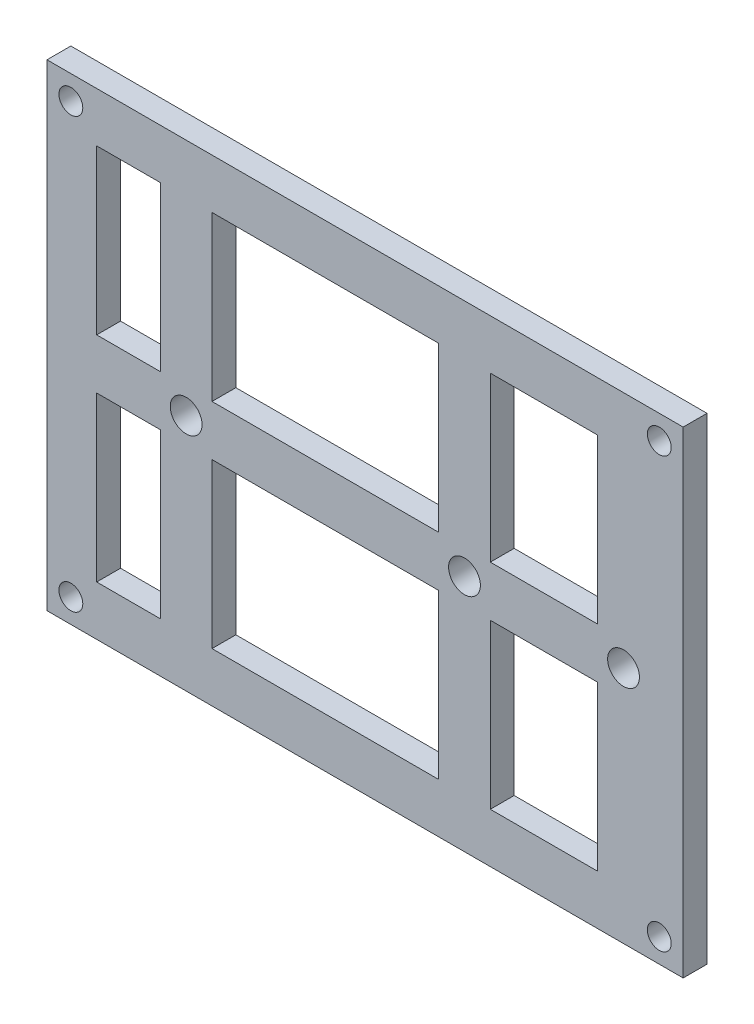
ISO-10303-21;
HEADER;
FILE_DESCRIPTION(('STEP AP214'),'2;1');
FILE_NAME('part.step','',(''),(''),'','','');
FILE_SCHEMA(('AUTOMOTIVE_DESIGN { 1 0 10303 214 1 1 1 1 }'));
ENDSEC;
DATA;
#1=APPLICATION_CONTEXT('core data for automotive mechanical design processes');
#2=APPLICATION_PROTOCOL_DEFINITION('international standard','automotive_design',2000,#1);
#3=PRODUCT_CONTEXT('',#1,'mechanical');
#4=PRODUCT('Part','Part','',(#3));
#5=PRODUCT_RELATED_PRODUCT_CATEGORY('part','',(#4));
#6=PRODUCT_DEFINITION_FORMATION('','',#4);
#7=PRODUCT_DEFINITION_CONTEXT('part definition',#1,'design');
#8=PRODUCT_DEFINITION('design','',#6,#7);
#9=PRODUCT_DEFINITION_SHAPE('','',#8);
#10=(LENGTH_UNIT() NAMED_UNIT(*) SI_UNIT(.MILLI.,.METRE.));
#11=(NAMED_UNIT(*) PLANE_ANGLE_UNIT() SI_UNIT($,.RADIAN.));
#12=(NAMED_UNIT(*) SI_UNIT($,.STERADIAN.) SOLID_ANGLE_UNIT());
#13=UNCERTAINTY_MEASURE_WITH_UNIT(LENGTH_MEASURE(1.E-05),#10,'distance_accuracy_value','');
#14=(GEOMETRIC_REPRESENTATION_CONTEXT(3) GLOBAL_UNCERTAINTY_ASSIGNED_CONTEXT((#13)) GLOBAL_UNIT_ASSIGNED_CONTEXT((#10,
#11,#12)) REPRESENTATION_CONTEXT('',''));
#15=CARTESIAN_POINT('',(0.,0.,0.));
#16=DIRECTION('',(0.,0.,1.));
#17=DIRECTION('',(1.,0.,0.));
#18=AXIS2_PLACEMENT_3D('',#15,#16,#17);
#19=CARTESIAN_POINT('',(0.,0.,3.));
#20=DIRECTION('',(0.,0.,1.));
#21=DIRECTION('',(1.,0.,0.));
#22=AXIS2_PLACEMENT_3D('',#19,#20,#21);
#23=PLANE('',#22);
#24=CARTESIAN_POINT('',(37.,-27.,3.));
#25=DIRECTION('',(0.,0.,1.));
#26=DIRECTION('',(1.,0.,0.));
#27=AXIS2_PLACEMENT_3D('',#24,#25,#26);
#28=CIRCLE('',#27,1.5);
#29=CARTESIAN_POINT('',(38.5,-27.,3.));
#30=VERTEX_POINT('',#29);
#31=EDGE_CURVE('E636',#30,#30,#28,.T.);
#32=ORIENTED_EDGE('',*,*,#31,.F.);
#33=EDGE_LOOP('',(#32));
#34=FACE_BOUND('',#33,.T.);
#35=CARTESIAN_POINT('',(-37.,27.,3.));
#36=DIRECTION('',(0.,0.,1.));
#37=DIRECTION('',(1.,0.,0.));
#38=AXIS2_PLACEMENT_3D('',#35,#36,#37);
#39=CIRCLE('',#38,1.5);
#40=CARTESIAN_POINT('',(-35.5,27.,3.));
#41=VERTEX_POINT('',#40);
#42=EDGE_CURVE('E260',#41,#41,#39,.T.);
#43=ORIENTED_EDGE('',*,*,#42,.F.);
#44=EDGE_LOOP('',(#43));
#45=FACE_BOUND('',#44,.T.);
#46=DIRECTION('',(1.,0.,0.));
#47=VECTOR('',#46,1.);
#48=CARTESIAN_POINT('',(15.75,3.16454204456221,3.));
#49=LINE('',#48,#47);
#50=CARTESIAN_POINT('',(15.75,3.16454204456221,3.));
#51=VERTEX_POINT('',#50);
#52=CARTESIAN_POINT('',(29.25,3.16454204456221,3.));
#53=VERTEX_POINT('',#52);
#54=EDGE_CURVE('E416',#51,#53,#49,.T.);
#55=ORIENTED_EDGE('',*,*,#54,.F.);
#56=DIRECTION('',(0.,-1.,0.));
#57=VECTOR('',#56,1.);
#58=CARTESIAN_POINT('',(15.75,23.75,3.));
#59=LINE('',#58,#57);
#60=CARTESIAN_POINT('',(15.75,23.75,3.));
#61=VERTEX_POINT('',#60);
#62=EDGE_CURVE('E413',#61,#51,#59,.T.);
#63=ORIENTED_EDGE('',*,*,#62,.F.);
#64=DIRECTION('',(-1.,0.,0.));
#65=VECTOR('',#64,1.);
#66=CARTESIAN_POINT('',(15.75,23.75,3.));
#67=LINE('',#66,#65);
#68=CARTESIAN_POINT('',(29.25,23.75,3.));
#69=VERTEX_POINT('',#68);
#70=EDGE_CURVE('E424',#69,#61,#67,.T.);
#71=ORIENTED_EDGE('',*,*,#70,.F.);
#72=DIRECTION('',(0.,1.,0.));
#73=VECTOR('',#72,1.);
#74=CARTESIAN_POINT('',(29.25,23.75,3.));
#75=LINE('',#74,#73);
#76=EDGE_CURVE('E420',#53,#69,#75,.T.);
#77=ORIENTED_EDGE('',*,*,#76,.F.);
#78=EDGE_LOOP('',(#55,#63,#71,#77));
#79=FACE_BOUND('',#78,.T.);
#80=DIRECTION('',(1.,0.,0.));
#81=VECTOR('',#80,1.);
#82=CARTESIAN_POINT('',(-19.25,3.16454204456221,3.));
#83=LINE('',#82,#81);
#84=CARTESIAN_POINT('',(-19.25,3.16454204456221,3.));
#85=VERTEX_POINT('',#84);
#86=CARTESIAN_POINT('',(9.25,3.16454204456221,3.));
#87=VERTEX_POINT('',#86);
#88=EDGE_CURVE('E459',#85,#87,#83,.T.);
#89=ORIENTED_EDGE('',*,*,#88,.F.);
#90=DIRECTION('',(0.,-1.,0.));
#91=VECTOR('',#90,1.);
#92=CARTESIAN_POINT('',(-19.25,23.75,3.));
#93=LINE('',#92,#91);
#94=CARTESIAN_POINT('',(-19.25,23.75,3.));
#95=VERTEX_POINT('',#94);
#96=EDGE_CURVE('E456',#95,#85,#93,.T.);
#97=ORIENTED_EDGE('',*,*,#96,.F.);
#98=DIRECTION('',(-1.,0.,0.));
#99=VECTOR('',#98,1.);
#100=CARTESIAN_POINT('',(-19.25,23.75,3.));
#101=LINE('',#100,#99);
#102=CARTESIAN_POINT('',(9.25,23.75,3.));
#103=VERTEX_POINT('',#102);
#104=EDGE_CURVE('E467',#103,#95,#101,.T.);
#105=ORIENTED_EDGE('',*,*,#104,.F.);
#106=DIRECTION('',(0.,1.,0.));
#107=VECTOR('',#106,1.);
#108=CARTESIAN_POINT('',(9.25,23.75,3.));
#109=LINE('',#108,#107);
#110=EDGE_CURVE('E463',#87,#103,#109,.T.);
#111=ORIENTED_EDGE('',*,*,#110,.F.);
#112=EDGE_LOOP('',(#89,#97,#105,#111));
#113=FACE_BOUND('',#112,.T.);
#114=CARTESIAN_POINT('',(12.5,0.,3.));
#115=DIRECTION('',(0.,0.,1.));
#116=DIRECTION('',(1.,0.,0.));
#117=AXIS2_PLACEMENT_3D('',#114,#115,#116);
#118=CIRCLE('',#117,2.);
#119=CARTESIAN_POINT('',(14.5,0.,3.));
#120=VERTEX_POINT('',#119);
#121=EDGE_CURVE('E499',#120,#120,#118,.T.);
#122=ORIENTED_EDGE('',*,*,#121,.F.);
#123=EDGE_LOOP('',(#122));
#124=FACE_BOUND('',#123,.T.);
#125=DIRECTION('',(0.,1.,0.));
#126=VECTOR('',#125,1.);
#127=CARTESIAN_POINT('',(40.,30.,3.));
#128=LINE('',#127,#126);
#129=CARTESIAN_POINT('',(40.,-30.,3.));
#130=VERTEX_POINT('',#129);
#131=CARTESIAN_POINT('',(40.,30.,3.));
#132=VERTEX_POINT('',#131);
#133=EDGE_CURVE('E515',#130,#132,#128,.T.);
#134=ORIENTED_EDGE('',*,*,#133,.T.);
#135=DIRECTION('',(-1.,0.,0.));
#136=VECTOR('',#135,1.);
#137=CARTESIAN_POINT('',(-40.,30.,3.));
#138=LINE('',#137,#136);
#139=CARTESIAN_POINT('',(-40.,30.,3.));
#140=VERTEX_POINT('',#139);
#141=EDGE_CURVE('E519',#132,#140,#138,.T.);
#142=ORIENTED_EDGE('',*,*,#141,.T.);
#143=DIRECTION('',(0.,-1.,0.));
#144=VECTOR('',#143,1.);
#145=CARTESIAN_POINT('',(-40.,30.,3.));
#146=LINE('',#145,#144);
#147=CARTESIAN_POINT('',(-40.,-30.,3.));
#148=VERTEX_POINT('',#147);
#149=EDGE_CURVE('E523',#140,#148,#146,.T.);
#150=ORIENTED_EDGE('',*,*,#149,.T.);
#151=DIRECTION('',(1.,0.,0.));
#152=VECTOR('',#151,1.);
#153=CARTESIAN_POINT('',(-40.,-30.,3.));
#154=LINE('',#153,#152);
#155=EDGE_CURVE('E526',#148,#130,#154,.T.);
#156=ORIENTED_EDGE('',*,*,#155,.T.);
#157=EDGE_LOOP('',(#134,#142,#150,#156));
#158=FACE_BOUND('',#157,.T.);
#159=CARTESIAN_POINT('',(32.5,0.,3.));
#160=DIRECTION('',(0.,0.,1.));
#161=DIRECTION('',(1.,0.,0.));
#162=AXIS2_PLACEMENT_3D('',#159,#160,#161);
#163=CIRCLE('',#162,2.);
#164=CARTESIAN_POINT('',(34.5,0.,3.));
#165=VERTEX_POINT('',#164);
#166=EDGE_CURVE('E507',#165,#165,#163,.T.);
#167=ORIENTED_EDGE('',*,*,#166,.F.);
#168=EDGE_LOOP('',(#167));
#169=FACE_BOUND('',#168,.T.);
#170=CARTESIAN_POINT('',(-22.5,0.,3.));
#171=DIRECTION('',(0.,0.,1.));
#172=DIRECTION('',(1.,0.,0.));
#173=AXIS2_PLACEMENT_3D('',#170,#171,#172);
#174=CIRCLE('',#173,2.);
#175=CARTESIAN_POINT('',(-20.5,0.,3.));
#176=VERTEX_POINT('',#175);
#177=EDGE_CURVE('E405',#176,#176,#174,.T.);
#178=ORIENTED_EDGE('',*,*,#177,.F.);
#179=EDGE_LOOP('',(#178));
#180=FACE_BOUND('',#179,.T.);
#181=DIRECTION('',(1.,0.,0.));
#182=VECTOR('',#181,1.);
#183=CARTESIAN_POINT('',(-33.75,3.16454204456221,3.));
#184=LINE('',#183,#182);
#185=CARTESIAN_POINT('',(-33.75,3.16454204456221,3.));
#186=VERTEX_POINT('',#185);
#187=CARTESIAN_POINT('',(-25.75,3.16454204456221,3.));
#188=VERTEX_POINT('',#187);
#189=EDGE_CURVE('E365',#186,#188,#184,.T.);
#190=ORIENTED_EDGE('',*,*,#189,.F.);
#191=DIRECTION('',(0.,-1.,0.));
#192=VECTOR('',#191,1.);
#193=CARTESIAN_POINT('',(-33.75,23.75,3.));
#194=LINE('',#193,#192);
#195=CARTESIAN_POINT('',(-33.75,23.75,3.));
#196=VERTEX_POINT('',#195);
#197=EDGE_CURVE('E362',#196,#186,#194,.T.);
#198=ORIENTED_EDGE('',*,*,#197,.F.);
#199=DIRECTION('',(-1.,0.,0.));
#200=VECTOR('',#199,1.);
#201=CARTESIAN_POINT('',(-33.75,23.75,3.));
#202=LINE('',#201,#200);
#203=CARTESIAN_POINT('',(-25.75,23.75,3.));
#204=VERTEX_POINT('',#203);
#205=EDGE_CURVE('E373',#204,#196,#202,.T.);
#206=ORIENTED_EDGE('',*,*,#205,.F.);
#207=DIRECTION('',(0.,1.,0.));
#208=VECTOR('',#207,1.);
#209=CARTESIAN_POINT('',(-25.75,23.75,3.));
#210=LINE('',#209,#208);
#211=EDGE_CURVE('E369',#188,#204,#210,.T.);
#212=ORIENTED_EDGE('',*,*,#211,.F.);
#213=EDGE_LOOP('',(#190,#198,#206,#212));
#214=FACE_BOUND('',#213,.T.);
#215=DIRECTION('',(1.,0.,0.));
#216=VECTOR('',#215,1.);
#217=CARTESIAN_POINT('',(15.75,-23.75,3.));
#218=LINE('',#217,#216);
#219=CARTESIAN_POINT('',(15.75,-23.75,3.));
#220=VERTEX_POINT('',#219);
#221=CARTESIAN_POINT('',(29.25,-23.75,3.));
#222=VERTEX_POINT('',#221);
#223=EDGE_CURVE('E322',#220,#222,#218,.T.);
#224=ORIENTED_EDGE('',*,*,#223,.F.);
#225=DIRECTION('',(0.,-1.,0.));
#226=VECTOR('',#225,1.);
#227=CARTESIAN_POINT('',(15.75,-23.75,3.));
#228=LINE('',#227,#226);
#229=CARTESIAN_POINT('',(15.75,-3.16454204456221,3.));
#230=VERTEX_POINT('',#229);
#231=EDGE_CURVE('E319',#230,#220,#228,.T.);
#232=ORIENTED_EDGE('',*,*,#231,.F.);
#233=DIRECTION('',(-1.,0.,0.));
#234=VECTOR('',#233,1.);
#235=CARTESIAN_POINT('',(15.75,-3.16454204456221,3.));
#236=LINE('',#235,#234);
#237=CARTESIAN_POINT('',(29.25,-3.16454204456221,3.));
#238=VERTEX_POINT('',#237);
#239=EDGE_CURVE('E330',#238,#230,#236,.T.);
#240=ORIENTED_EDGE('',*,*,#239,.F.);
#241=DIRECTION('',(0.,1.,0.));
#242=VECTOR('',#241,1.);
#243=CARTESIAN_POINT('',(29.25,-23.75,3.));
#244=LINE('',#243,#242);
#245=EDGE_CURVE('E326',#222,#238,#244,.T.);
#246=ORIENTED_EDGE('',*,*,#245,.F.);
#247=EDGE_LOOP('',(#224,#232,#240,#246));
#248=FACE_BOUND('',#247,.T.);
#249=DIRECTION('',(1.,0.,0.));
#250=VECTOR('',#249,1.);
#251=CARTESIAN_POINT('',(-19.25,-23.75,3.));
#252=LINE('',#251,#250);
#253=CARTESIAN_POINT('',(-19.25,-23.75,3.));
#254=VERTEX_POINT('',#253);
#255=CARTESIAN_POINT('',(9.25,-23.75,3.));
#256=VERTEX_POINT('',#255);
#257=EDGE_CURVE('E279',#254,#256,#252,.T.);
#258=ORIENTED_EDGE('',*,*,#257,.F.);
#259=DIRECTION('',(0.,-1.,0.));
#260=VECTOR('',#259,1.);
#261=CARTESIAN_POINT('',(-19.25,-23.75,3.));
#262=LINE('',#261,#260);
#263=CARTESIAN_POINT('',(-19.25,-3.16454204456221,3.));
#264=VERTEX_POINT('',#263);
#265=EDGE_CURVE('E276',#264,#254,#262,.T.);
#266=ORIENTED_EDGE('',*,*,#265,.F.);
#267=DIRECTION('',(-1.,0.,0.));
#268=VECTOR('',#267,1.);
#269=CARTESIAN_POINT('',(-19.25,-3.16454204456221,3.));
#270=LINE('',#269,#268);
#271=CARTESIAN_POINT('',(9.25,-3.16454204456221,3.));
#272=VERTEX_POINT('',#271);
#273=EDGE_CURVE('E287',#272,#264,#270,.T.);
#274=ORIENTED_EDGE('',*,*,#273,.F.);
#275=DIRECTION('',(0.,1.,0.));
#276=VECTOR('',#275,1.);
#277=CARTESIAN_POINT('',(9.25,-23.75,3.));
#278=LINE('',#277,#276);
#279=EDGE_CURVE('E283',#256,#272,#278,.T.);
#280=ORIENTED_EDGE('',*,*,#279,.F.);
#281=EDGE_LOOP('',(#258,#266,#274,#280));
#282=FACE_BOUND('',#281,.T.);
#283=DIRECTION('',(1.,0.,0.));
#284=VECTOR('',#283,1.);
#285=CARTESIAN_POINT('',(-33.75,-23.75,3.));
#286=LINE('',#285,#284);
#287=CARTESIAN_POINT('',(-33.75,-23.75,3.));
#288=VERTEX_POINT('',#287);
#289=CARTESIAN_POINT('',(-25.75,-23.75,3.));
#290=VERTEX_POINT('',#289);
#291=EDGE_CURVE('E234',#288,#290,#286,.T.);
#292=ORIENTED_EDGE('',*,*,#291,.F.);
#293=DIRECTION('',(0.,-1.,0.));
#294=VECTOR('',#293,1.);
#295=CARTESIAN_POINT('',(-33.75,-23.75,3.));
#296=LINE('',#295,#294);
#297=CARTESIAN_POINT('',(-33.75,-3.16454204456221,3.));
#298=VERTEX_POINT('',#297);
#299=EDGE_CURVE('E225',#298,#288,#296,.T.);
#300=ORIENTED_EDGE('',*,*,#299,.F.);
#301=DIRECTION('',(-1.,0.,0.));
#302=VECTOR('',#301,1.);
#303=CARTESIAN_POINT('',(-33.75,-3.16454204456221,3.));
#304=LINE('',#303,#302);
#305=CARTESIAN_POINT('',(-25.75,-3.16454204456221,3.));
#306=VERTEX_POINT('',#305);
#307=EDGE_CURVE('E252',#306,#298,#304,.T.);
#308=ORIENTED_EDGE('',*,*,#307,.F.);
#309=DIRECTION('',(0.,1.,0.));
#310=VECTOR('',#309,1.);
#311=CARTESIAN_POINT('',(-25.75,-23.75,3.));
#312=LINE('',#311,#310);
#313=EDGE_CURVE('E248',#290,#306,#312,.T.);
#314=ORIENTED_EDGE('',*,*,#313,.F.);
#315=EDGE_LOOP('',(#292,#300,#308,#314));
#316=FACE_BOUND('',#315,.T.);
#317=CARTESIAN_POINT('',(-37.,-27.,3.));
#318=DIRECTION('',(0.,0.,1.));
#319=DIRECTION('',(-1.,0.,0.));
#320=AXIS2_PLACEMENT_3D('',#317,#318,#319);
#321=CIRCLE('',#320,1.5);
#322=CARTESIAN_POINT('',(-38.5,-27.,3.));
#323=VERTEX_POINT('',#322);
#324=EDGE_CURVE('E642',#323,#323,#321,.T.);
#325=ORIENTED_EDGE('',*,*,#324,.F.);
#326=EDGE_LOOP('',(#325));
#327=FACE_BOUND('',#326,.T.);
#328=CARTESIAN_POINT('',(37.,27.,3.));
#329=DIRECTION('',(0.,0.,1.));
#330=DIRECTION('',(-1.,0.,0.));
#331=AXIS2_PLACEMENT_3D('',#328,#329,#330);
#332=CIRCLE('',#331,1.5);
#333=CARTESIAN_POINT('',(35.5,27.,3.));
#334=VERTEX_POINT('',#333);
#335=EDGE_CURVE('E630',#334,#334,#332,.T.);
#336=ORIENTED_EDGE('',*,*,#335,.F.);
#337=EDGE_LOOP('',(#336));
#338=FACE_BOUND('',#337,.T.);
#339=ADVANCED_FACE('F39',(#34,#45,#79,#113,#124,#158,#169,#180,#214,#248,#282,#316,#327,#338),
#23,.T.);
#340=CARTESIAN_POINT('',(0.,0.,0.));
#341=DIRECTION('',(0.,0.,1.));
#342=DIRECTION('',(1.,0.,0.));
#343=AXIS2_PLACEMENT_3D('',#340,#341,#342);
#344=PLANE('',#343);
#345=DIRECTION('',(0.,-1.,0.));
#346=VECTOR('',#345,1.);
#347=CARTESIAN_POINT('',(-19.25,-23.75,0.));
#348=LINE('',#347,#346);
#349=CARTESIAN_POINT('',(-19.25,-3.16454204456221,0.));
#350=VERTEX_POINT('',#349);
#351=CARTESIAN_POINT('',(-19.25,-23.75,0.));
#352=VERTEX_POINT('',#351);
#353=EDGE_CURVE('E243',#350,#352,#348,.T.);
#354=ORIENTED_EDGE('',*,*,#353,.T.);
#355=DIRECTION('',(1.,0.,0.));
#356=VECTOR('',#355,1.);
#357=CARTESIAN_POINT('',(-19.25,-23.75,0.));
#358=LINE('',#357,#356);
#359=CARTESIAN_POINT('',(9.25,-23.75,0.));
#360=VERTEX_POINT('',#359);
#361=EDGE_CURVE('E294',#352,#360,#358,.T.);
#362=ORIENTED_EDGE('',*,*,#361,.T.);
#363=DIRECTION('',(0.,1.,0.));
#364=VECTOR('',#363,1.);
#365=CARTESIAN_POINT('',(9.25,-23.75,0.));
#366=LINE('',#365,#364);
#367=CARTESIAN_POINT('',(9.25,-3.16454204456221,0.));
#368=VERTEX_POINT('',#367);
#369=EDGE_CURVE('E298',#360,#368,#366,.T.);
#370=ORIENTED_EDGE('',*,*,#369,.T.);
#371=DIRECTION('',(-1.,0.,0.));
#372=VECTOR('',#371,1.);
#373=CARTESIAN_POINT('',(-19.25,-3.16454204456221,0.));
#374=LINE('',#373,#372);
#375=EDGE_CURVE('E280',#368,#350,#374,.T.);
#376=ORIENTED_EDGE('',*,*,#375,.T.);
#377=EDGE_LOOP('',(#354,#362,#370,#376));
#378=FACE_BOUND('',#377,.T.);
#379=DIRECTION('',(0.,-1.,0.));
#380=VECTOR('',#379,1.);
#381=CARTESIAN_POINT('',(-33.75,23.75,0.));
#382=LINE('',#381,#380);
#383=CARTESIAN_POINT('',(-33.75,23.75,0.));
#384=VERTEX_POINT('',#383);
#385=CARTESIAN_POINT('',(-33.75,3.16454204456221,0.));
#386=VERTEX_POINT('',#385);
#387=EDGE_CURVE('E361',#384,#386,#382,.T.);
#388=ORIENTED_EDGE('',*,*,#387,.T.);
#389=DIRECTION('',(1.,0.,0.));
#390=VECTOR('',#389,1.);
#391=CARTESIAN_POINT('',(-33.75,3.16454204456221,0.));
#392=LINE('',#391,#390);
#393=CARTESIAN_POINT('',(-25.75,3.16454204456221,0.));
#394=VERTEX_POINT('',#393);
#395=EDGE_CURVE('E380',#386,#394,#392,.T.);
#396=ORIENTED_EDGE('',*,*,#395,.T.);
#397=DIRECTION('',(0.,1.,0.));
#398=VECTOR('',#397,1.);
#399=CARTESIAN_POINT('',(-25.75,23.75,0.));
#400=LINE('',#399,#398);
#401=CARTESIAN_POINT('',(-25.75,23.75,0.));
#402=VERTEX_POINT('',#401);
#403=EDGE_CURVE('E384',#394,#402,#400,.T.);
#404=ORIENTED_EDGE('',*,*,#403,.T.);
#405=DIRECTION('',(-1.,0.,0.));
#406=VECTOR('',#405,1.);
#407=CARTESIAN_POINT('',(-33.75,23.75,0.));
#408=LINE('',#407,#406);
#409=EDGE_CURVE('E366',#402,#384,#408,.T.);
#410=ORIENTED_EDGE('',*,*,#409,.T.);
#411=EDGE_LOOP('',(#388,#396,#404,#410));
#412=FACE_BOUND('',#411,.T.);
#413=DIRECTION('',(0.,-1.,0.));
#414=VECTOR('',#413,1.);
#415=CARTESIAN_POINT('',(-19.25,23.75,0.));
#416=LINE('',#415,#414);
#417=CARTESIAN_POINT('',(-19.25,23.75,0.));
#418=VERTEX_POINT('',#417);
#419=CARTESIAN_POINT('',(-19.25,3.16454204456221,0.));
#420=VERTEX_POINT('',#419);
#421=EDGE_CURVE('E455',#418,#420,#416,.T.);
#422=ORIENTED_EDGE('',*,*,#421,.T.);
#423=DIRECTION('',(1.,0.,0.));
#424=VECTOR('',#423,1.);
#425=CARTESIAN_POINT('',(-19.25,3.16454204456221,0.));
#426=LINE('',#425,#424);
#427=CARTESIAN_POINT('',(9.25,3.16454204456221,0.));
#428=VERTEX_POINT('',#427);
#429=EDGE_CURVE('E474',#420,#428,#426,.T.);
#430=ORIENTED_EDGE('',*,*,#429,.T.);
#431=DIRECTION('',(0.,1.,0.));
#432=VECTOR('',#431,1.);
#433=CARTESIAN_POINT('',(9.25,23.75,0.));
#434=LINE('',#433,#432);
#435=CARTESIAN_POINT('',(9.25,23.75,0.));
#436=VERTEX_POINT('',#435);
#437=EDGE_CURVE('E478',#428,#436,#434,.T.);
#438=ORIENTED_EDGE('',*,*,#437,.T.);
#439=DIRECTION('',(-1.,0.,0.));
#440=VECTOR('',#439,1.);
#441=CARTESIAN_POINT('',(-19.25,23.75,0.));
#442=LINE('',#441,#440);
#443=EDGE_CURVE('E460',#436,#418,#442,.T.);
#444=ORIENTED_EDGE('',*,*,#443,.T.);
#445=EDGE_LOOP('',(#422,#430,#438,#444));
#446=FACE_BOUND('',#445,.T.);
#447=DIRECTION('',(0.,1.,0.));
#448=VECTOR('',#447,1.);
#449=CARTESIAN_POINT('',(40.,30.,0.));
#450=LINE('',#449,#448);
#451=CARTESIAN_POINT('',(40.,-30.,0.));
#452=VERTEX_POINT('',#451);
#453=CARTESIAN_POINT('',(40.,30.,0.));
#454=VERTEX_POINT('',#453);
#455=EDGE_CURVE('E511',#452,#454,#450,.T.);
#456=ORIENTED_EDGE('',*,*,#455,.F.);
#457=DIRECTION('',(1.,0.,0.));
#458=VECTOR('',#457,1.);
#459=CARTESIAN_POINT('',(-40.,-30.,0.));
#460=LINE('',#459,#458);
#461=CARTESIAN_POINT('',(-40.,-30.,0.));
#462=VERTEX_POINT('',#461);
#463=EDGE_CURVE('E520',#462,#452,#460,.T.);
#464=ORIENTED_EDGE('',*,*,#463,.F.);
#465=DIRECTION('',(0.,-1.,0.));
#466=VECTOR('',#465,1.);
#467=CARTESIAN_POINT('',(-40.,30.,0.));
#468=LINE('',#467,#466);
#469=CARTESIAN_POINT('',(-40.,30.,0.));
#470=VERTEX_POINT('',#469);
#471=EDGE_CURVE('E536',#470,#462,#468,.T.);
#472=ORIENTED_EDGE('',*,*,#471,.F.);
#473=DIRECTION('',(-1.,0.,0.));
#474=VECTOR('',#473,1.);
#475=CARTESIAN_POINT('',(-40.,30.,0.));
#476=LINE('',#475,#474);
#477=EDGE_CURVE('E533',#454,#470,#476,.T.);
#478=ORIENTED_EDGE('',*,*,#477,.F.);
#479=EDGE_LOOP('',(#456,#464,#472,#478));
#480=FACE_BOUND('',#479,.T.);
#481=CARTESIAN_POINT('',(32.5,0.,0.));
#482=DIRECTION('',(0.,0.,1.));
#483=DIRECTION('',(1.,0.,0.));
#484=AXIS2_PLACEMENT_3D('',#481,#482,#483);
#485=CIRCLE('',#484,2.);
#486=CARTESIAN_POINT('',(34.5,0.,0.));
#487=VERTEX_POINT('',#486);
#488=EDGE_CURVE('E503',#487,#487,#485,.T.);
#489=ORIENTED_EDGE('',*,*,#488,.T.);
#490=EDGE_LOOP('',(#489));
#491=FACE_BOUND('',#490,.T.);
#492=CARTESIAN_POINT('',(12.5,0.,0.));
#493=DIRECTION('',(0.,0.,1.));
#494=DIRECTION('',(1.,0.,0.));
#495=AXIS2_PLACEMENT_3D('',#492,#493,#494);
#496=CIRCLE('',#495,2.);
#497=CARTESIAN_POINT('',(14.5,0.,0.));
#498=VERTEX_POINT('',#497);
#499=EDGE_CURVE('E498',#498,#498,#496,.T.);
#500=ORIENTED_EDGE('',*,*,#499,.T.);
#501=EDGE_LOOP('',(#500));
#502=FACE_BOUND('',#501,.T.);
#503=DIRECTION('',(0.,-1.,0.));
#504=VECTOR('',#503,1.);
#505=CARTESIAN_POINT('',(15.75,23.75,0.));
#506=LINE('',#505,#504);
#507=CARTESIAN_POINT('',(15.75,23.75,0.));
#508=VERTEX_POINT('',#507);
#509=CARTESIAN_POINT('',(15.75,3.16454204456221,0.));
#510=VERTEX_POINT('',#509);
#511=EDGE_CURVE('E409',#508,#510,#506,.T.);
#512=ORIENTED_EDGE('',*,*,#511,.T.);
#513=DIRECTION('',(1.,0.,0.));
#514=VECTOR('',#513,1.);
#515=CARTESIAN_POINT('',(15.75,3.16454204456221,0.));
#516=LINE('',#515,#514);
#517=CARTESIAN_POINT('',(29.25,3.16454204456221,0.));
#518=VERTEX_POINT('',#517);
#519=EDGE_CURVE('E431',#510,#518,#516,.T.);
#520=ORIENTED_EDGE('',*,*,#519,.T.);
#521=DIRECTION('',(0.,1.,0.));
#522=VECTOR('',#521,1.);
#523=CARTESIAN_POINT('',(29.25,23.75,0.));
#524=LINE('',#523,#522);
#525=CARTESIAN_POINT('',(29.25,23.75,0.));
#526=VERTEX_POINT('',#525);
#527=EDGE_CURVE('E435',#518,#526,#524,.T.);
#528=ORIENTED_EDGE('',*,*,#527,.T.);
#529=DIRECTION('',(-1.,0.,0.));
#530=VECTOR('',#529,1.);
#531=CARTESIAN_POINT('',(15.75,23.75,0.));
#532=LINE('',#531,#530);
#533=EDGE_CURVE('E417',#526,#508,#532,.T.);
#534=ORIENTED_EDGE('',*,*,#533,.T.);
#535=EDGE_LOOP('',(#512,#520,#528,#534));
#536=FACE_BOUND('',#535,.T.);
#537=CARTESIAN_POINT('',(-22.5,0.,0.));
#538=DIRECTION('',(0.,0.,1.));
#539=DIRECTION('',(1.,0.,0.));
#540=AXIS2_PLACEMENT_3D('',#537,#538,#539);
#541=CIRCLE('',#540,2.);
#542=CARTESIAN_POINT('',(-20.5,0.,0.));
#543=VERTEX_POINT('',#542);
#544=EDGE_CURVE('E404',#543,#543,#541,.T.);
#545=ORIENTED_EDGE('',*,*,#544,.T.);
#546=EDGE_LOOP('',(#545));
#547=FACE_BOUND('',#546,.T.);
#548=DIRECTION('',(0.,-1.,0.));
#549=VECTOR('',#548,1.);
#550=CARTESIAN_POINT('',(15.75,-23.75,0.));
#551=LINE('',#550,#549);
#552=CARTESIAN_POINT('',(15.75,-3.16454204456221,0.));
#553=VERTEX_POINT('',#552);
#554=CARTESIAN_POINT('',(15.75,-23.75,0.));
#555=VERTEX_POINT('',#554);
#556=EDGE_CURVE('E318',#553,#555,#551,.T.);
#557=ORIENTED_EDGE('',*,*,#556,.T.);
#558=DIRECTION('',(1.,0.,0.));
#559=VECTOR('',#558,1.);
#560=CARTESIAN_POINT('',(15.75,-23.75,0.));
#561=LINE('',#560,#559);
#562=CARTESIAN_POINT('',(29.25,-23.75,0.));
#563=VERTEX_POINT('',#562);
#564=EDGE_CURVE('E337',#555,#563,#561,.T.);
#565=ORIENTED_EDGE('',*,*,#564,.T.);
#566=DIRECTION('',(0.,1.,0.));
#567=VECTOR('',#566,1.);
#568=CARTESIAN_POINT('',(29.25,-23.75,0.));
#569=LINE('',#568,#567);
#570=CARTESIAN_POINT('',(29.25,-3.16454204456221,0.));
#571=VERTEX_POINT('',#570);
#572=EDGE_CURVE('E341',#563,#571,#569,.T.);
#573=ORIENTED_EDGE('',*,*,#572,.T.);
#574=DIRECTION('',(-1.,0.,0.));
#575=VECTOR('',#574,1.);
#576=CARTESIAN_POINT('',(15.75,-3.16454204456221,0.));
#577=LINE('',#576,#575);
#578=EDGE_CURVE('E323',#571,#553,#577,.T.);
#579=ORIENTED_EDGE('',*,*,#578,.T.);
#580=EDGE_LOOP('',(#557,#565,#573,#579));
#581=FACE_BOUND('',#580,.T.);
#582=DIRECTION('',(0.,-1.,0.));
#583=VECTOR('',#582,1.);
#584=CARTESIAN_POINT('',(-33.75,-23.75,0.));
#585=LINE('',#584,#583);
#586=CARTESIAN_POINT('',(-33.75,-3.16454204456221,0.));
#587=VERTEX_POINT('',#586);
#588=CARTESIAN_POINT('',(-33.75,-23.75,0.));
#589=VERTEX_POINT('',#588);
#590=EDGE_CURVE('E63',#587,#589,#585,.T.);
#591=ORIENTED_EDGE('',*,*,#590,.T.);
#592=DIRECTION('',(1.,0.,0.));
#593=VECTOR('',#592,1.);
#594=CARTESIAN_POINT('',(-33.75,-23.75,0.));
#595=LINE('',#594,#593);
#596=CARTESIAN_POINT('',(-25.75,-23.75,0.));
#597=VERTEX_POINT('',#596);
#598=EDGE_CURVE('E241',#589,#597,#595,.T.);
#599=ORIENTED_EDGE('',*,*,#598,.T.);
#600=DIRECTION('',(0.,1.,0.));
#601=VECTOR('',#600,1.);
#602=CARTESIAN_POINT('',(-25.75,-23.75,0.));
#603=LINE('',#602,#601);
#604=CARTESIAN_POINT('',(-25.75,-3.16454204456221,0.));
#605=VERTEX_POINT('',#604);
#606=EDGE_CURVE('E263',#597,#605,#603,.T.);
#607=ORIENTED_EDGE('',*,*,#606,.T.);
#608=DIRECTION('',(-1.,0.,0.));
#609=VECTOR('',#608,1.);
#610=CARTESIAN_POINT('',(-33.75,-3.16454204456221,0.));
#611=LINE('',#610,#609);
#612=EDGE_CURVE('E235',#605,#587,#611,.T.);
#613=ORIENTED_EDGE('',*,*,#612,.T.);
#614=EDGE_LOOP('',(#591,#599,#607,#613));
#615=FACE_BOUND('',#614,.T.);
#616=CARTESIAN_POINT('',(-37.,27.,0.));
#617=DIRECTION('',(0.,0.,1.));
#618=DIRECTION('',(1.,0.,0.));
#619=AXIS2_PLACEMENT_3D('',#616,#617,#618);
#620=CIRCLE('',#619,1.5);
#621=CARTESIAN_POINT('',(-35.5,27.,0.));
#622=VERTEX_POINT('',#621);
#623=EDGE_CURVE('E616',#622,#622,#620,.T.);
#624=ORIENTED_EDGE('',*,*,#623,.T.);
#625=EDGE_LOOP('',(#624));
#626=FACE_BOUND('',#625,.T.);
#627=CARTESIAN_POINT('',(-37.,-27.,0.));
#628=DIRECTION('',(0.,0.,1.));
#629=DIRECTION('',(-1.,0.,0.));
#630=AXIS2_PLACEMENT_3D('',#627,#628,#629);
#631=CIRCLE('',#630,1.5);
#632=CARTESIAN_POINT('',(-38.5,-27.,0.));
#633=VERTEX_POINT('',#632);
#634=EDGE_CURVE('E620',#633,#633,#631,.T.);
#635=ORIENTED_EDGE('',*,*,#634,.T.);
#636=EDGE_LOOP('',(#635));
#637=FACE_BOUND('',#636,.T.);
#638=CARTESIAN_POINT('',(37.,-27.,0.));
#639=DIRECTION('',(0.,0.,1.));
#640=DIRECTION('',(1.,0.,0.));
#641=AXIS2_PLACEMENT_3D('',#638,#639,#640);
#642=CIRCLE('',#641,1.5);
#643=CARTESIAN_POINT('',(38.5,-27.,0.));
#644=VERTEX_POINT('',#643);
#645=EDGE_CURVE('E624',#644,#644,#642,.T.);
#646=ORIENTED_EDGE('',*,*,#645,.T.);
#647=EDGE_LOOP('',(#646));
#648=FACE_BOUND('',#647,.T.);
#649=CARTESIAN_POINT('',(37.,27.,0.));
#650=DIRECTION('',(0.,0.,1.));
#651=DIRECTION('',(-1.,0.,0.));
#652=AXIS2_PLACEMENT_3D('',#649,#650,#651);
#653=CIRCLE('',#652,1.5);
#654=CARTESIAN_POINT('',(35.5,27.,0.));
#655=VERTEX_POINT('',#654);
#656=EDGE_CURVE('E627',#655,#655,#653,.T.);
#657=ORIENTED_EDGE('',*,*,#656,.T.);
#658=EDGE_LOOP('',(#657));
#659=FACE_BOUND('',#658,.T.);
#660=ADVANCED_FACE('F559',(#378,#412,#446,#480,#491,#502,#536,#547,#581,#615,#626,#637,#648,
#659),#344,.F.);
#661=CARTESIAN_POINT('',(40.,30.,3.));
#662=DIRECTION('',(-1.,0.,0.));
#663=DIRECTION('',(0.,0.,1.));
#664=AXIS2_PLACEMENT_3D('',#661,#662,#663);
#665=PLANE('',#664);
#666=ORIENTED_EDGE('',*,*,#455,.T.);
#667=DIRECTION('',(0.,0.,-1.));
#668=VECTOR('',#667,1.);
#669=CARTESIAN_POINT('',(40.,30.,3.));
#670=LINE('',#669,#668);
#671=EDGE_CURVE('E11',#132,#454,#670,.T.);
#672=ORIENTED_EDGE('',*,*,#671,.F.);
#673=ORIENTED_EDGE('',*,*,#133,.F.);
#674=DIRECTION('',(0.,0.,-1.));
#675=VECTOR('',#674,1.);
#676=CARTESIAN_POINT('',(40.,-30.,3.));
#677=LINE('',#676,#675);
#678=EDGE_CURVE('E529',#130,#452,#677,.T.);
#679=ORIENTED_EDGE('',*,*,#678,.T.);
#680=EDGE_LOOP('',(#666,#672,#673,#679));
#681=FACE_BOUND('',#680,.T.);
#682=ADVANCED_FACE('F41',(#681),#665,.F.);
#683=CARTESIAN_POINT('',(-40.,30.,3.));
#684=DIRECTION('',(0.,-1.,0.));
#685=DIRECTION('',(0.,0.,-1.));
#686=AXIS2_PLACEMENT_3D('',#683,#684,#685);
#687=PLANE('',#686);
#688=ORIENTED_EDGE('',*,*,#477,.T.);
#689=DIRECTION('',(0.,0.,-1.));
#690=VECTOR('',#689,1.);
#691=CARTESIAN_POINT('',(-40.,30.,3.));
#692=LINE('',#691,#690);
#693=EDGE_CURVE('E48',#140,#470,#692,.T.);
#694=ORIENTED_EDGE('',*,*,#693,.F.);
#695=ORIENTED_EDGE('',*,*,#141,.F.);
#696=ORIENTED_EDGE('',*,*,#671,.T.);
#697=EDGE_LOOP('',(#688,#694,#695,#696));
#698=FACE_BOUND('',#697,.T.);
#699=ADVANCED_FACE('F570',(#698),#687,.F.);
#700=CARTESIAN_POINT('',(-40.,30.,3.));
#701=DIRECTION('',(1.,0.,0.));
#702=DIRECTION('',(0.,0.,-1.));
#703=AXIS2_PLACEMENT_3D('',#700,#701,#702);
#704=PLANE('',#703);
#705=ORIENTED_EDGE('',*,*,#471,.T.);
#706=DIRECTION('',(0.,0.,-1.));
#707=VECTOR('',#706,1.);
#708=CARTESIAN_POINT('',(-40.,-30.,3.));
#709=LINE('',#708,#707);
#710=EDGE_CURVE('E544',#148,#462,#709,.T.);
#711=ORIENTED_EDGE('',*,*,#710,.F.);
#712=ORIENTED_EDGE('',*,*,#149,.F.);
#713=ORIENTED_EDGE('',*,*,#693,.T.);
#714=EDGE_LOOP('',(#705,#711,#712,#713));
#715=FACE_BOUND('',#714,.T.);
#716=ADVANCED_FACE('F553',(#715),#704,.F.);
#717=CARTESIAN_POINT('',(-40.,-30.,3.));
#718=DIRECTION('',(0.,1.,0.));
#719=DIRECTION('',(0.,0.,1.));
#720=AXIS2_PLACEMENT_3D('',#717,#718,#719);
#721=PLANE('',#720);
#722=ORIENTED_EDGE('',*,*,#463,.T.);
#723=ORIENTED_EDGE('',*,*,#678,.F.);
#724=ORIENTED_EDGE('',*,*,#155,.F.);
#725=ORIENTED_EDGE('',*,*,#710,.T.);
#726=EDGE_LOOP('',(#722,#723,#724,#725));
#727=FACE_BOUND('',#726,.T.);
#728=ADVANCED_FACE('F563',(#727),#721,.F.);
#729=CARTESIAN_POINT('',(32.5,0.,3.));
#730=DIRECTION('',(0.,0.,-1.));
#731=DIRECTION('',(-1.,0.,0.));
#732=AXIS2_PLACEMENT_3D('',#729,#730,#731);
#733=CYLINDRICAL_SURFACE('',#732,2.);
#734=ORIENTED_EDGE('',*,*,#166,.T.);
#735=EDGE_LOOP('',(#734));
#736=FACE_BOUND('',#735,.T.);
#737=ORIENTED_EDGE('',*,*,#488,.F.);
#738=EDGE_LOOP('',(#737));
#739=FACE_BOUND('',#738,.T.);
#740=ADVANCED_FACE('F588',(#736,#739),#733,.F.);
#741=CARTESIAN_POINT('',(12.5,0.,3.));
#742=DIRECTION('',(0.,0.,-1.));
#743=DIRECTION('',(-1.,0.,0.));
#744=AXIS2_PLACEMENT_3D('',#741,#742,#743);
#745=CYLINDRICAL_SURFACE('',#744,2.);
#746=ORIENTED_EDGE('',*,*,#121,.T.);
#747=EDGE_LOOP('',(#746));
#748=FACE_BOUND('',#747,.T.);
#749=ORIENTED_EDGE('',*,*,#499,.F.);
#750=EDGE_LOOP('',(#749));
#751=FACE_BOUND('',#750,.T.);
#752=ADVANCED_FACE('F595',(#748,#751),#745,.F.);
#753=CARTESIAN_POINT('',(-19.25,23.75,3.));
#754=DIRECTION('',(1.,0.,0.));
#755=DIRECTION('',(0.,1.,0.));
#756=AXIS2_PLACEMENT_3D('',#753,#754,#755);
#757=PLANE('',#756);
#758=ORIENTED_EDGE('',*,*,#421,.F.);
#759=DIRECTION('',(0.,0.,-1.));
#760=VECTOR('',#759,1.);
#761=CARTESIAN_POINT('',(-19.25,23.75,3.));
#762=LINE('',#761,#760);
#763=EDGE_CURVE('E470',#95,#418,#762,.T.);
#764=ORIENTED_EDGE('',*,*,#763,.F.);
#765=ORIENTED_EDGE('',*,*,#96,.T.);
#766=DIRECTION('',(0.,0.,-1.));
#767=VECTOR('',#766,1.);
#768=CARTESIAN_POINT('',(-19.25,3.16454204456221,3.));
#769=LINE('',#768,#767);
#770=EDGE_CURVE('E494',#85,#420,#769,.T.);
#771=ORIENTED_EDGE('',*,*,#770,.T.);
#772=EDGE_LOOP('',(#758,#764,#765,#771));
#773=FACE_BOUND('',#772,.T.);
#774=ADVANCED_FACE('F600',(#773),#757,.T.);
#775=CARTESIAN_POINT('',(-19.25,3.16454204456221,3.));
#776=DIRECTION('',(0.,1.,0.));
#777=DIRECTION('',(0.,0.,1.));
#778=AXIS2_PLACEMENT_3D('',#775,#776,#777);
#779=PLANE('',#778);
#780=ORIENTED_EDGE('',*,*,#429,.F.);
#781=ORIENTED_EDGE('',*,*,#770,.F.);
#782=ORIENTED_EDGE('',*,*,#88,.T.);
#783=DIRECTION('',(0.,0.,-1.));
#784=VECTOR('',#783,1.);
#785=CARTESIAN_POINT('',(9.25,3.16454204456221,3.));
#786=LINE('',#785,#784);
#787=EDGE_CURVE('E491',#87,#428,#786,.T.);
#788=ORIENTED_EDGE('',*,*,#787,.T.);
#789=EDGE_LOOP('',(#780,#781,#782,#788));
#790=FACE_BOUND('',#789,.T.);
#791=ADVANCED_FACE('F670',(#790),#779,.T.);
#792=CARTESIAN_POINT('',(9.25,23.75,3.));
#793=DIRECTION('',(-1.,0.,0.));
#794=DIRECTION('',(0.,-1.,0.));
#795=AXIS2_PLACEMENT_3D('',#792,#793,#794);
#796=PLANE('',#795);
#797=ORIENTED_EDGE('',*,*,#437,.F.);
#798=ORIENTED_EDGE('',*,*,#787,.F.);
#799=ORIENTED_EDGE('',*,*,#110,.T.);
#800=DIRECTION('',(0.,0.,-1.));
#801=VECTOR('',#800,1.);
#802=CARTESIAN_POINT('',(9.25,23.75,3.));
#803=LINE('',#802,#801);
#804=EDGE_CURVE('E488',#103,#436,#803,.T.);
#805=ORIENTED_EDGE('',*,*,#804,.T.);
#806=EDGE_LOOP('',(#797,#798,#799,#805));
#807=FACE_BOUND('',#806,.T.);
#808=ADVANCED_FACE('F673',(#807),#796,.T.);
#809=CARTESIAN_POINT('',(-19.25,23.75,3.));
#810=DIRECTION('',(0.,-1.,0.));
#811=DIRECTION('',(0.,0.,-1.));
#812=AXIS2_PLACEMENT_3D('',#809,#810,#811);
#813=PLANE('',#812);
#814=ORIENTED_EDGE('',*,*,#443,.F.);
#815=ORIENTED_EDGE('',*,*,#804,.F.);
#816=ORIENTED_EDGE('',*,*,#104,.T.);
#817=ORIENTED_EDGE('',*,*,#763,.T.);
#818=EDGE_LOOP('',(#814,#815,#816,#817));
#819=FACE_BOUND('',#818,.T.);
#820=ADVANCED_FACE('F679',(#819),#813,.T.);
#821=CARTESIAN_POINT('',(15.75,23.75,3.));
#822=DIRECTION('',(1.,0.,0.));
#823=DIRECTION('',(0.,0.,-1.));
#824=AXIS2_PLACEMENT_3D('',#821,#822,#823);
#825=PLANE('',#824);
#826=ORIENTED_EDGE('',*,*,#511,.F.);
#827=DIRECTION('',(0.,0.,-1.));
#828=VECTOR('',#827,1.);
#829=CARTESIAN_POINT('',(15.75,23.75,3.));
#830=LINE('',#829,#828);
#831=EDGE_CURVE('E427',#61,#508,#830,.T.);
#832=ORIENTED_EDGE('',*,*,#831,.F.);
#833=ORIENTED_EDGE('',*,*,#62,.T.);
#834=DIRECTION('',(0.,0.,-1.));
#835=VECTOR('',#834,1.);
#836=CARTESIAN_POINT('',(15.75,3.16454204456221,3.));
#837=LINE('',#836,#835);
#838=EDGE_CURVE('E451',#51,#510,#837,.T.);
#839=ORIENTED_EDGE('',*,*,#838,.T.);
#840=EDGE_LOOP('',(#826,#832,#833,#839));
#841=FACE_BOUND('',#840,.T.);
#842=ADVANCED_FACE('F681',(#841),#825,.T.);
#843=CARTESIAN_POINT('',(15.75,3.16454204456221,3.));
#844=DIRECTION('',(0.,1.,0.));
#845=DIRECTION('',(0.,0.,1.));
#846=AXIS2_PLACEMENT_3D('',#843,#844,#845);
#847=PLANE('',#846);
#848=ORIENTED_EDGE('',*,*,#519,.F.);
#849=ORIENTED_EDGE('',*,*,#838,.F.);
#850=ORIENTED_EDGE('',*,*,#54,.T.);
#851=DIRECTION('',(0.,0.,-1.));
#852=VECTOR('',#851,1.);
#853=CARTESIAN_POINT('',(29.25,3.16454204456221,3.));
#854=LINE('',#853,#852);
#855=EDGE_CURVE('E448',#53,#518,#854,.T.);
#856=ORIENTED_EDGE('',*,*,#855,.T.);
#857=EDGE_LOOP('',(#848,#849,#850,#856));
#858=FACE_BOUND('',#857,.T.);
#859=ADVANCED_FACE('F687',(#858),#847,.T.);
#860=CARTESIAN_POINT('',(29.25,23.75,3.));
#861=DIRECTION('',(-1.,0.,0.));
#862=DIRECTION('',(0.,0.,1.));
#863=AXIS2_PLACEMENT_3D('',#860,#861,#862);
#864=PLANE('',#863);
#865=ORIENTED_EDGE('',*,*,#527,.F.);
#866=ORIENTED_EDGE('',*,*,#855,.F.);
#867=ORIENTED_EDGE('',*,*,#76,.T.);
#868=DIRECTION('',(0.,0.,-1.));
#869=VECTOR('',#868,1.);
#870=CARTESIAN_POINT('',(29.25,23.75,3.));
#871=LINE('',#870,#869);
#872=EDGE_CURVE('E445',#69,#526,#871,.T.);
#873=ORIENTED_EDGE('',*,*,#872,.T.);
#874=EDGE_LOOP('',(#865,#866,#867,#873));
#875=FACE_BOUND('',#874,.T.);
#876=ADVANCED_FACE('F727',(#875),#864,.T.);
#877=CARTESIAN_POINT('',(15.75,23.75,3.));
#878=DIRECTION('',(0.,-1.,0.));
#879=DIRECTION('',(0.,0.,-1.));
#880=AXIS2_PLACEMENT_3D('',#877,#878,#879);
#881=PLANE('',#880);
#882=ORIENTED_EDGE('',*,*,#533,.F.);
#883=ORIENTED_EDGE('',*,*,#872,.F.);
#884=ORIENTED_EDGE('',*,*,#70,.T.);
#885=ORIENTED_EDGE('',*,*,#831,.T.);
#886=EDGE_LOOP('',(#882,#883,#884,#885));
#887=FACE_BOUND('',#886,.T.);
#888=ADVANCED_FACE('F736',(#887),#881,.T.);
#889=CARTESIAN_POINT('',(-22.5,0.,3.));
#890=DIRECTION('',(0.,0.,-1.));
#891=DIRECTION('',(-1.,0.,0.));
#892=AXIS2_PLACEMENT_3D('',#889,#890,#891);
#893=CYLINDRICAL_SURFACE('',#892,2.);
#894=ORIENTED_EDGE('',*,*,#177,.T.);
#895=EDGE_LOOP('',(#894));
#896=FACE_BOUND('',#895,.T.);
#897=ORIENTED_EDGE('',*,*,#544,.F.);
#898=EDGE_LOOP('',(#897));
#899=FACE_BOUND('',#898,.T.);
#900=ADVANCED_FACE('F746',(#896,#899),#893,.F.);
#901=CARTESIAN_POINT('',(-33.75,23.75,3.));
#902=DIRECTION('',(1.,0.,0.));
#903=DIRECTION('',(0.,0.,-1.));
#904=AXIS2_PLACEMENT_3D('',#901,#902,#903);
#905=PLANE('',#904);
#906=ORIENTED_EDGE('',*,*,#387,.F.);
#907=DIRECTION('',(0.,0.,-1.));
#908=VECTOR('',#907,1.);
#909=CARTESIAN_POINT('',(-33.75,23.75,3.));
#910=LINE('',#909,#908);
#911=EDGE_CURVE('E376',#196,#384,#910,.T.);
#912=ORIENTED_EDGE('',*,*,#911,.F.);
#913=ORIENTED_EDGE('',*,*,#197,.T.);
#914=DIRECTION('',(0.,0.,-1.));
#915=VECTOR('',#914,1.);
#916=CARTESIAN_POINT('',(-33.75,3.16454204456221,3.));
#917=LINE('',#916,#915);
#918=EDGE_CURVE('E400',#186,#386,#917,.T.);
#919=ORIENTED_EDGE('',*,*,#918,.T.);
#920=EDGE_LOOP('',(#906,#912,#913,#919));
#921=FACE_BOUND('',#920,.T.);
#922=ADVANCED_FACE('F756',(#921),#905,.T.);
#923=CARTESIAN_POINT('',(-33.75,3.16454204456221,3.));
#924=DIRECTION('',(0.,1.,0.));
#925=DIRECTION('',(0.,0.,1.));
#926=AXIS2_PLACEMENT_3D('',#923,#924,#925);
#927=PLANE('',#926);
#928=ORIENTED_EDGE('',*,*,#395,.F.);
#929=ORIENTED_EDGE('',*,*,#918,.F.);
#930=ORIENTED_EDGE('',*,*,#189,.T.);
#931=DIRECTION('',(0.,0.,-1.));
#932=VECTOR('',#931,1.);
#933=CARTESIAN_POINT('',(-25.75,3.16454204456221,3.));
#934=LINE('',#933,#932);
#935=EDGE_CURVE('E397',#188,#394,#934,.T.);
#936=ORIENTED_EDGE('',*,*,#935,.T.);
#937=EDGE_LOOP('',(#928,#929,#930,#936));
#938=FACE_BOUND('',#937,.T.);
#939=ADVANCED_FACE('F766',(#938),#927,.T.);
#940=CARTESIAN_POINT('',(-25.75,23.75,3.));
#941=DIRECTION('',(-1.,0.,0.));
#942=DIRECTION('',(0.,-1.,0.));
#943=AXIS2_PLACEMENT_3D('',#940,#941,#942);
#944=PLANE('',#943);
#945=ORIENTED_EDGE('',*,*,#403,.F.);
#946=ORIENTED_EDGE('',*,*,#935,.F.);
#947=ORIENTED_EDGE('',*,*,#211,.T.);
#948=DIRECTION('',(0.,0.,-1.));
#949=VECTOR('',#948,1.);
#950=CARTESIAN_POINT('',(-25.75,23.75,3.));
#951=LINE('',#950,#949);
#952=EDGE_CURVE('E394',#204,#402,#951,.T.);
#953=ORIENTED_EDGE('',*,*,#952,.T.);
#954=EDGE_LOOP('',(#945,#946,#947,#953));
#955=FACE_BOUND('',#954,.T.);
#956=ADVANCED_FACE('F776',(#955),#944,.T.);
#957=CARTESIAN_POINT('',(-33.75,23.75,3.));
#958=DIRECTION('',(0.,-1.,0.));
#959=DIRECTION('',(0.,0.,-1.));
#960=AXIS2_PLACEMENT_3D('',#957,#958,#959);
#961=PLANE('',#960);
#962=ORIENTED_EDGE('',*,*,#409,.F.);
#963=ORIENTED_EDGE('',*,*,#952,.F.);
#964=ORIENTED_EDGE('',*,*,#205,.T.);
#965=ORIENTED_EDGE('',*,*,#911,.T.);
#966=EDGE_LOOP('',(#962,#963,#964,#965));
#967=FACE_BOUND('',#966,.T.);
#968=ADVANCED_FACE('F786',(#967),#961,.T.);
#969=CARTESIAN_POINT('',(15.75,-23.75,3.));
#970=DIRECTION('',(1.,0.,0.));
#971=DIRECTION('',(0.,0.,-1.));
#972=AXIS2_PLACEMENT_3D('',#969,#970,#971);
#973=PLANE('',#972);
#974=ORIENTED_EDGE('',*,*,#556,.F.);
#975=DIRECTION('',(0.,0.,-1.));
#976=VECTOR('',#975,1.);
#977=CARTESIAN_POINT('',(15.75,-3.16454204456221,3.));
#978=LINE('',#977,#976);
#979=EDGE_CURVE('E333',#230,#553,#978,.T.);
#980=ORIENTED_EDGE('',*,*,#979,.F.);
#981=ORIENTED_EDGE('',*,*,#231,.T.);
#982=DIRECTION('',(0.,0.,-1.));
#983=VECTOR('',#982,1.);
#984=CARTESIAN_POINT('',(15.75,-23.75,3.));
#985=LINE('',#984,#983);
#986=EDGE_CURVE('E357',#220,#555,#985,.T.);
#987=ORIENTED_EDGE('',*,*,#986,.T.);
#988=EDGE_LOOP('',(#974,#980,#981,#987));
#989=FACE_BOUND('',#988,.T.);
#990=ADVANCED_FACE('F796',(#989),#973,.T.);
#991=CARTESIAN_POINT('',(15.75,-23.75,3.));
#992=DIRECTION('',(0.,1.,0.));
#993=DIRECTION('',(0.,0.,1.));
#994=AXIS2_PLACEMENT_3D('',#991,#992,#993);
#995=PLANE('',#994);
#996=ORIENTED_EDGE('',*,*,#564,.F.);
#997=ORIENTED_EDGE('',*,*,#986,.F.);
#998=ORIENTED_EDGE('',*,*,#223,.T.);
#999=DIRECTION('',(0.,0.,-1.));
#1000=VECTOR('',#999,1.);
#1001=CARTESIAN_POINT('',(29.25,-23.75,3.));
#1002=LINE('',#1001,#1000);
#1003=EDGE_CURVE('E354',#222,#563,#1002,.T.);
#1004=ORIENTED_EDGE('',*,*,#1003,.T.);
#1005=EDGE_LOOP('',(#996,#997,#998,#1004));
#1006=FACE_BOUND('',#1005,.T.);
#1007=ADVANCED_FACE('F806',(#1006),#995,.T.);
#1008=CARTESIAN_POINT('',(29.25,-23.75,3.));
#1009=DIRECTION('',(-1.,0.,0.));
#1010=DIRECTION('',(0.,0.,1.));
#1011=AXIS2_PLACEMENT_3D('',#1008,#1009,#1010);
#1012=PLANE('',#1011);
#1013=ORIENTED_EDGE('',*,*,#572,.F.);
#1014=ORIENTED_EDGE('',*,*,#1003,.F.);
#1015=ORIENTED_EDGE('',*,*,#245,.T.);
#1016=DIRECTION('',(0.,0.,-1.));
#1017=VECTOR('',#1016,1.);
#1018=CARTESIAN_POINT('',(29.25,-3.16454204456221,3.));
#1019=LINE('',#1018,#1017);
#1020=EDGE_CURVE('E351',#238,#571,#1019,.T.);
#1021=ORIENTED_EDGE('',*,*,#1020,.T.);
#1022=EDGE_LOOP('',(#1013,#1014,#1015,#1021));
#1023=FACE_BOUND('',#1022,.T.);
#1024=ADVANCED_FACE('F816',(#1023),#1012,.T.);
#1025=CARTESIAN_POINT('',(15.75,-3.16454204456221,3.));
#1026=DIRECTION('',(0.,-1.,0.));
#1027=DIRECTION('',(0.,0.,-1.));
#1028=AXIS2_PLACEMENT_3D('',#1025,#1026,#1027);
#1029=PLANE('',#1028);
#1030=ORIENTED_EDGE('',*,*,#578,.F.);
#1031=ORIENTED_EDGE('',*,*,#1020,.F.);
#1032=ORIENTED_EDGE('',*,*,#239,.T.);
#1033=ORIENTED_EDGE('',*,*,#979,.T.);
#1034=EDGE_LOOP('',(#1030,#1031,#1032,#1033));
#1035=FACE_BOUND('',#1034,.T.);
#1036=ADVANCED_FACE('F826',(#1035),#1029,.T.);
#1037=CARTESIAN_POINT('',(-19.25,-23.75,3.));
#1038=DIRECTION('',(1.,0.,0.));
#1039=DIRECTION('',(0.,1.,0.));
#1040=AXIS2_PLACEMENT_3D('',#1037,#1038,#1039);
#1041=PLANE('',#1040);
#1042=ORIENTED_EDGE('',*,*,#353,.F.);
#1043=DIRECTION('',(0.,0.,-1.));
#1044=VECTOR('',#1043,1.);
#1045=CARTESIAN_POINT('',(-19.25,-3.16454204456221,3.));
#1046=LINE('',#1045,#1044);
#1047=EDGE_CURVE('E290',#264,#350,#1046,.T.);
#1048=ORIENTED_EDGE('',*,*,#1047,.F.);
#1049=ORIENTED_EDGE('',*,*,#265,.T.);
#1050=DIRECTION('',(0.,0.,-1.));
#1051=VECTOR('',#1050,1.);
#1052=CARTESIAN_POINT('',(-19.25,-23.75,3.));
#1053=LINE('',#1052,#1051);
#1054=EDGE_CURVE('E314',#254,#352,#1053,.T.);
#1055=ORIENTED_EDGE('',*,*,#1054,.T.);
#1056=EDGE_LOOP('',(#1042,#1048,#1049,#1055));
#1057=FACE_BOUND('',#1056,.T.);
#1058=ADVANCED_FACE('F836',(#1057),#1041,.T.);
#1059=CARTESIAN_POINT('',(-19.25,-23.75,3.));
#1060=DIRECTION('',(0.,1.,0.));
#1061=DIRECTION('',(0.,0.,1.));
#1062=AXIS2_PLACEMENT_3D('',#1059,#1060,#1061);
#1063=PLANE('',#1062);
#1064=ORIENTED_EDGE('',*,*,#361,.F.);
#1065=ORIENTED_EDGE('',*,*,#1054,.F.);
#1066=ORIENTED_EDGE('',*,*,#257,.T.);
#1067=DIRECTION('',(0.,0.,-1.));
#1068=VECTOR('',#1067,1.);
#1069=CARTESIAN_POINT('',(9.25,-23.75,3.));
#1070=LINE('',#1069,#1068);
#1071=EDGE_CURVE('E311',#256,#360,#1070,.T.);
#1072=ORIENTED_EDGE('',*,*,#1071,.T.);
#1073=EDGE_LOOP('',(#1064,#1065,#1066,#1072));
#1074=FACE_BOUND('',#1073,.T.);
#1075=ADVANCED_FACE('F846',(#1074),#1063,.T.);
#1076=CARTESIAN_POINT('',(9.25,-23.75,3.));
#1077=DIRECTION('',(-1.,0.,0.));
#1078=DIRECTION('',(0.,-1.,0.));
#1079=AXIS2_PLACEMENT_3D('',#1076,#1077,#1078);
#1080=PLANE('',#1079);
#1081=ORIENTED_EDGE('',*,*,#369,.F.);
#1082=ORIENTED_EDGE('',*,*,#1071,.F.);
#1083=ORIENTED_EDGE('',*,*,#279,.T.);
#1084=DIRECTION('',(0.,0.,-1.));
#1085=VECTOR('',#1084,1.);
#1086=CARTESIAN_POINT('',(9.25,-3.16454204456221,3.));
#1087=LINE('',#1086,#1085);
#1088=EDGE_CURVE('E308',#272,#368,#1087,.T.);
#1089=ORIENTED_EDGE('',*,*,#1088,.T.);
#1090=EDGE_LOOP('',(#1081,#1082,#1083,#1089));
#1091=FACE_BOUND('',#1090,.T.);
#1092=ADVANCED_FACE('F856',(#1091),#1080,.T.);
#1093=CARTESIAN_POINT('',(-19.25,-3.16454204456221,3.));
#1094=DIRECTION('',(0.,-1.,0.));
#1095=DIRECTION('',(0.,0.,-1.));
#1096=AXIS2_PLACEMENT_3D('',#1093,#1094,#1095);
#1097=PLANE('',#1096);
#1098=ORIENTED_EDGE('',*,*,#375,.F.);
#1099=ORIENTED_EDGE('',*,*,#1088,.F.);
#1100=ORIENTED_EDGE('',*,*,#273,.T.);
#1101=ORIENTED_EDGE('',*,*,#1047,.T.);
#1102=EDGE_LOOP('',(#1098,#1099,#1100,#1101));
#1103=FACE_BOUND('',#1102,.T.);
#1104=ADVANCED_FACE('F866',(#1103),#1097,.T.);
#1105=CARTESIAN_POINT('',(-33.75,-23.75,3.));
#1106=DIRECTION('',(1.,0.,0.));
#1107=DIRECTION('',(0.,0.,-1.));
#1108=AXIS2_PLACEMENT_3D('',#1105,#1106,#1107);
#1109=PLANE('',#1108);
#1110=ORIENTED_EDGE('',*,*,#590,.F.);
#1111=DIRECTION('',(0.,0.,-1.));
#1112=VECTOR('',#1111,1.);
#1113=CARTESIAN_POINT('',(-33.75,-3.16454204456221,3.));
#1114=LINE('',#1113,#1112);
#1115=EDGE_CURVE('E229',#298,#587,#1114,.T.);
#1116=ORIENTED_EDGE('',*,*,#1115,.F.);
#1117=ORIENTED_EDGE('',*,*,#299,.T.);
#1118=DIRECTION('',(0.,0.,-1.));
#1119=VECTOR('',#1118,1.);
#1120=CARTESIAN_POINT('',(-33.75,-23.75,3.));
#1121=LINE('',#1120,#1119);
#1122=EDGE_CURVE('E228',#288,#589,#1121,.T.);
#1123=ORIENTED_EDGE('',*,*,#1122,.T.);
#1124=EDGE_LOOP('',(#1110,#1116,#1117,#1123));
#1125=FACE_BOUND('',#1124,.T.);
#1126=ADVANCED_FACE('F227',(#1125),#1109,.T.);
#1127=CARTESIAN_POINT('',(-33.75,-23.75,3.));
#1128=DIRECTION('',(0.,1.,0.));
#1129=DIRECTION('',(0.,0.,1.));
#1130=AXIS2_PLACEMENT_3D('',#1127,#1128,#1129);
#1131=PLANE('',#1130);
#1132=ORIENTED_EDGE('',*,*,#598,.F.);
#1133=ORIENTED_EDGE('',*,*,#1122,.F.);
#1134=ORIENTED_EDGE('',*,*,#291,.T.);
#1135=DIRECTION('',(0.,0.,-1.));
#1136=VECTOR('',#1135,1.);
#1137=CARTESIAN_POINT('',(-25.75,-23.75,3.));
#1138=LINE('',#1137,#1136);
#1139=EDGE_CURVE('E244',#290,#597,#1138,.T.);
#1140=ORIENTED_EDGE('',*,*,#1139,.T.);
#1141=EDGE_LOOP('',(#1132,#1133,#1134,#1140));
#1142=FACE_BOUND('',#1141,.T.);
#1143=ADVANCED_FACE('F238',(#1142),#1131,.T.);
#1144=CARTESIAN_POINT('',(-25.75,-23.75,3.));
#1145=DIRECTION('',(-1.,0.,0.));
#1146=DIRECTION('',(0.,-1.,0.));
#1147=AXIS2_PLACEMENT_3D('',#1144,#1145,#1146);
#1148=PLANE('',#1147);
#1149=ORIENTED_EDGE('',*,*,#606,.F.);
#1150=ORIENTED_EDGE('',*,*,#1139,.F.);
#1151=ORIENTED_EDGE('',*,*,#313,.T.);
#1152=DIRECTION('',(0.,0.,-1.));
#1153=VECTOR('',#1152,1.);
#1154=CARTESIAN_POINT('',(-25.75,-3.16454204456221,3.));
#1155=LINE('',#1154,#1153);
#1156=EDGE_CURVE('E55',#306,#605,#1155,.T.);
#1157=ORIENTED_EDGE('',*,*,#1156,.T.);
#1158=EDGE_LOOP('',(#1149,#1150,#1151,#1157));
#1159=FACE_BOUND('',#1158,.T.);
#1160=ADVANCED_FACE('F893',(#1159),#1148,.T.);
#1161=CARTESIAN_POINT('',(-33.75,-3.16454204456221,3.));
#1162=DIRECTION('',(0.,-1.,0.));
#1163=DIRECTION('',(0.,0.,-1.));
#1164=AXIS2_PLACEMENT_3D('',#1161,#1162,#1163);
#1165=PLANE('',#1164);
#1166=ORIENTED_EDGE('',*,*,#612,.F.);
#1167=ORIENTED_EDGE('',*,*,#1156,.F.);
#1168=ORIENTED_EDGE('',*,*,#307,.T.);
#1169=ORIENTED_EDGE('',*,*,#1115,.T.);
#1170=EDGE_LOOP('',(#1166,#1167,#1168,#1169));
#1171=FACE_BOUND('',#1170,.T.);
#1172=ADVANCED_FACE('F902',(#1171),#1165,.T.);
#1173=CARTESIAN_POINT('',(-37.,27.,3.));
#1174=DIRECTION('',(0.,0.,-1.));
#1175=DIRECTION('',(-1.,0.,0.));
#1176=AXIS2_PLACEMENT_3D('',#1173,#1174,#1175);
#1177=CYLINDRICAL_SURFACE('',#1176,1.5);
#1178=ORIENTED_EDGE('',*,*,#42,.T.);
#1179=EDGE_LOOP('',(#1178));
#1180=FACE_BOUND('',#1179,.T.);
#1181=ORIENTED_EDGE('',*,*,#623,.F.);
#1182=EDGE_LOOP('',(#1181));
#1183=FACE_BOUND('',#1182,.T.);
#1184=ADVANCED_FACE('F653',(#1180,#1183),#1177,.F.);
#1185=CARTESIAN_POINT('',(-37.,-27.,3.));
#1186=DIRECTION('',(0.,0.,-1.));
#1187=DIRECTION('',(-1.,0.,0.));
#1188=AXIS2_PLACEMENT_3D('',#1185,#1186,#1187);
#1189=CYLINDRICAL_SURFACE('',#1188,1.5);
#1190=ORIENTED_EDGE('',*,*,#324,.T.);
#1191=EDGE_LOOP('',(#1190));
#1192=FACE_BOUND('',#1191,.T.);
#1193=ORIENTED_EDGE('',*,*,#634,.F.);
#1194=EDGE_LOOP('',(#1193));
#1195=FACE_BOUND('',#1194,.T.);
#1196=ADVANCED_FACE('F920',(#1192,#1195),#1189,.F.);
#1197=CARTESIAN_POINT('',(37.,-27.,3.));
#1198=DIRECTION('',(0.,0.,-1.));
#1199=DIRECTION('',(-1.,0.,0.));
#1200=AXIS2_PLACEMENT_3D('',#1197,#1198,#1199);
#1201=CYLINDRICAL_SURFACE('',#1200,1.5);
#1202=ORIENTED_EDGE('',*,*,#31,.T.);
#1203=EDGE_LOOP('',(#1202));
#1204=FACE_BOUND('',#1203,.T.);
#1205=ORIENTED_EDGE('',*,*,#645,.F.);
#1206=EDGE_LOOP('',(#1205));
#1207=FACE_BOUND('',#1206,.T.);
#1208=ADVANCED_FACE('F929',(#1204,#1207),#1201,.F.);
#1209=CARTESIAN_POINT('',(37.,27.,3.));
#1210=DIRECTION('',(0.,0.,-1.));
#1211=DIRECTION('',(-1.,0.,0.));
#1212=AXIS2_PLACEMENT_3D('',#1209,#1210,#1211);
#1213=CYLINDRICAL_SURFACE('',#1212,1.5);
#1214=ORIENTED_EDGE('',*,*,#335,.T.);
#1215=EDGE_LOOP('',(#1214));
#1216=FACE_BOUND('',#1215,.T.);
#1217=ORIENTED_EDGE('',*,*,#656,.F.);
#1218=EDGE_LOOP('',(#1217));
#1219=FACE_BOUND('',#1218,.T.);
#1220=ADVANCED_FACE('F939',(#1216,#1219),#1213,.F.);
#1221=CLOSED_SHELL('',(#339,#660,#682,#699,#716,#728,#740,#752,#774,#791,#808,#820,#842,#859,
#876,#888,#900,#922,#939,#956,#968,#990,#1007,#1024,#1036,#1058,#1075,#1092,#1104,#1126,#1143,
#1160,#1172,#1184,#1196,#1208,#1220));
#1222=MANIFOLD_SOLID_BREP('B2',#1221);
#1223=ADVANCED_BREP_SHAPE_REPRESENTATION('',(#18,#1222),#14);
#1224=SHAPE_DEFINITION_REPRESENTATION(#9,#1223);
ENDSEC;
END-ISO-10303-21;
